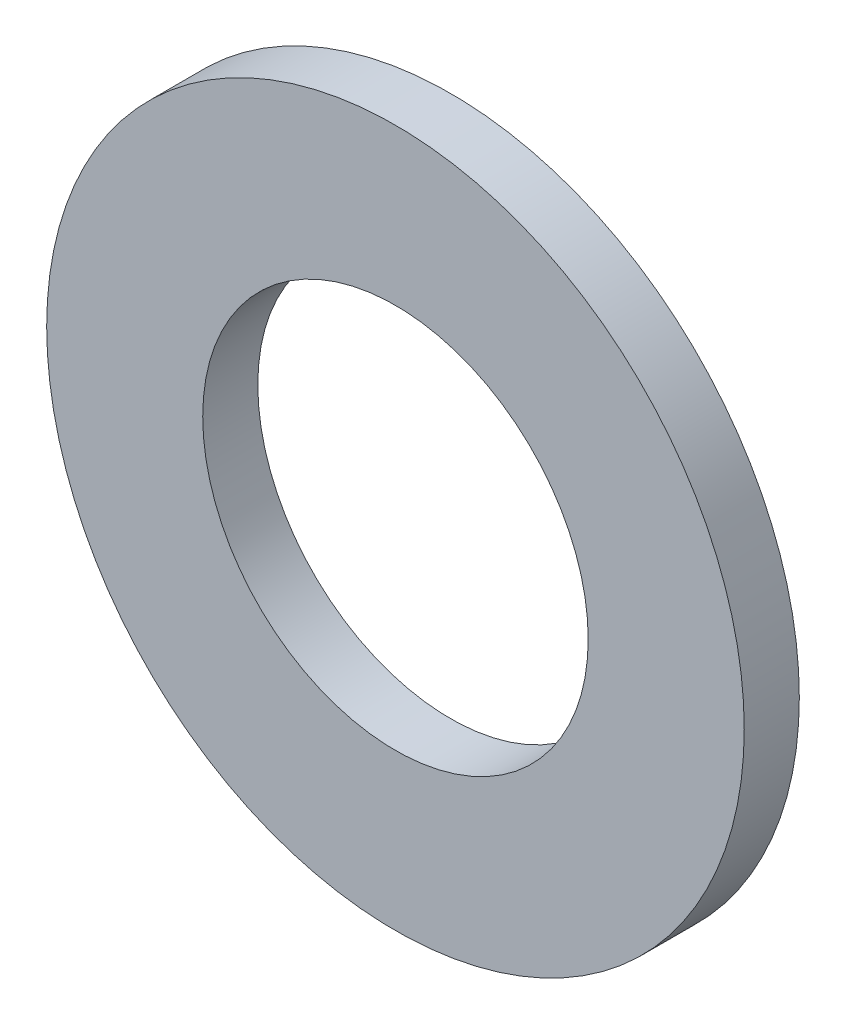
ISO-10303-21;
HEADER;
FILE_DESCRIPTION(('STEP AP214'),'2;1');
FILE_NAME('part.step','',(''),(''),'','','');
FILE_SCHEMA(('AUTOMOTIVE_DESIGN { 1 0 10303 214 1 1 1 1 }'));
ENDSEC;
DATA;
#1=APPLICATION_CONTEXT('core data for automotive mechanical design processes');
#2=APPLICATION_PROTOCOL_DEFINITION('international standard','automotive_design',2000,#1);
#3=PRODUCT_CONTEXT('',#1,'mechanical');
#4=PRODUCT('Part','Part','',(#3));
#5=PRODUCT_RELATED_PRODUCT_CATEGORY('part','',(#4));
#6=PRODUCT_DEFINITION_FORMATION('','',#4);
#7=PRODUCT_DEFINITION_CONTEXT('part definition',#1,'design');
#8=PRODUCT_DEFINITION('design','',#6,#7);
#9=PRODUCT_DEFINITION_SHAPE('','',#8);
#10=(LENGTH_UNIT() NAMED_UNIT(*) SI_UNIT(.MILLI.,.METRE.));
#11=(NAMED_UNIT(*) PLANE_ANGLE_UNIT() SI_UNIT($,.RADIAN.));
#12=(NAMED_UNIT(*) SI_UNIT($,.STERADIAN.) SOLID_ANGLE_UNIT());
#13=UNCERTAINTY_MEASURE_WITH_UNIT(LENGTH_MEASURE(1.E-05),#10,'distance_accuracy_value','');
#14=(GEOMETRIC_REPRESENTATION_CONTEXT(3) GLOBAL_UNCERTAINTY_ASSIGNED_CONTEXT((#13)) GLOBAL_UNIT_ASSIGNED_CONTEXT((#10,
#11,#12)) REPRESENTATION_CONTEXT('',''));
#15=CARTESIAN_POINT('',(0.,0.,0.));
#16=DIRECTION('',(0.,0.,1.));
#17=DIRECTION('',(1.,0.,0.));
#18=AXIS2_PLACEMENT_3D('',#15,#16,#17);
#19=CARTESIAN_POINT('',(0.,0.,0.3));
#20=DIRECTION('',(0.,0.,1.));
#21=DIRECTION('',(1.,0.,0.));
#22=AXIS2_PLACEMENT_3D('',#19,#20,#21);
#23=PLANE('',#22);
#24=CARTESIAN_POINT('',(0.,0.,0.3));
#25=DIRECTION('',(0.,0.,1.));
#26=DIRECTION('',(1.,0.,0.));
#27=AXIS2_PLACEMENT_3D('',#24,#25,#26);
#28=CIRCLE('',#27,1.9);
#29=CARTESIAN_POINT('',(1.9,0.,0.3));
#30=VERTEX_POINT('',#29);
#31=EDGE_CURVE('E10',#30,#30,#28,.T.);
#32=ORIENTED_EDGE('',*,*,#31,.T.);
#33=EDGE_LOOP('',(#32));
#34=FACE_BOUND('',#33,.T.);
#35=CARTESIAN_POINT('',(0.,0.,0.3));
#36=DIRECTION('',(0.,0.,1.));
#37=DIRECTION('',(1.,0.,0.));
#38=AXIS2_PLACEMENT_3D('',#35,#36,#37);
#39=CIRCLE('',#38,1.05);
#40=CARTESIAN_POINT('',(1.05,0.,0.3));
#41=VERTEX_POINT('',#40);
#42=EDGE_CURVE('E49',#41,#41,#39,.T.);
#43=ORIENTED_EDGE('',*,*,#42,.F.);
#44=EDGE_LOOP('',(#43));
#45=FACE_BOUND('',#44,.T.);
#46=ADVANCED_FACE('F39',(#34,#45),#23,.T.);
#47=CARTESIAN_POINT('',(0.,0.,0.));
#48=DIRECTION('',(0.,0.,1.));
#49=DIRECTION('',(1.,0.,0.));
#50=AXIS2_PLACEMENT_3D('',#47,#48,#49);
#51=PLANE('',#50);
#52=CARTESIAN_POINT('',(0.,0.,0.));
#53=DIRECTION('',(0.,0.,1.));
#54=DIRECTION('',(1.,0.,0.));
#55=AXIS2_PLACEMENT_3D('',#52,#53,#54);
#56=CIRCLE('',#55,1.9);
#57=CARTESIAN_POINT('',(1.9,0.,0.));
#58=VERTEX_POINT('',#57);
#59=EDGE_CURVE('E43',#58,#58,#56,.T.);
#60=ORIENTED_EDGE('',*,*,#59,.F.);
#61=EDGE_LOOP('',(#60));
#62=FACE_BOUND('',#61,.T.);
#63=CARTESIAN_POINT('',(0.,0.,0.));
#64=DIRECTION('',(0.,0.,1.));
#65=DIRECTION('',(1.,0.,0.));
#66=AXIS2_PLACEMENT_3D('',#63,#64,#65);
#67=CIRCLE('',#66,1.05);
#68=CARTESIAN_POINT('',(1.05,0.,0.));
#69=VERTEX_POINT('',#68);
#70=EDGE_CURVE('E55',#69,#69,#67,.T.);
#71=ORIENTED_EDGE('',*,*,#70,.T.);
#72=EDGE_LOOP('',(#71));
#73=FACE_BOUND('',#72,.T.);
#74=ADVANCED_FACE('F65',(#62,#73),#51,.F.);
#75=CARTESIAN_POINT('',(0.,0.,0.3));
#76=DIRECTION('',(0.,0.,-1.));
#77=DIRECTION('',(-1.,0.,0.));
#78=AXIS2_PLACEMENT_3D('',#75,#76,#77);
#79=CYLINDRICAL_SURFACE('',#78,1.9);
#80=ORIENTED_EDGE('',*,*,#31,.F.);
#81=EDGE_LOOP('',(#80));
#82=FACE_BOUND('',#81,.T.);
#83=ORIENTED_EDGE('',*,*,#59,.T.);
#84=EDGE_LOOP('',(#83));
#85=FACE_BOUND('',#84,.T.);
#86=ADVANCED_FACE('F41',(#82,#85),#79,.T.);
#87=CARTESIAN_POINT('',(0.,0.,0.3));
#88=DIRECTION('',(0.,0.,-1.));
#89=DIRECTION('',(-1.,0.,0.));
#90=AXIS2_PLACEMENT_3D('',#87,#88,#89);
#91=CYLINDRICAL_SURFACE('',#90,1.05);
#92=ORIENTED_EDGE('',*,*,#42,.T.);
#93=EDGE_LOOP('',(#92));
#94=FACE_BOUND('',#93,.T.);
#95=ORIENTED_EDGE('',*,*,#70,.F.);
#96=EDGE_LOOP('',(#95));
#97=FACE_BOUND('',#96,.T.);
#98=ADVANCED_FACE('F59',(#94,#97),#91,.F.);
#99=CLOSED_SHELL('',(#46,#74,#86,#98));
#100=MANIFOLD_SOLID_BREP('B2',#99);
#101=ADVANCED_BREP_SHAPE_REPRESENTATION('',(#18,#100),#14);
#102=SHAPE_DEFINITION_REPRESENTATION(#9,#101);
ENDSEC;
END-ISO-10303-21;
